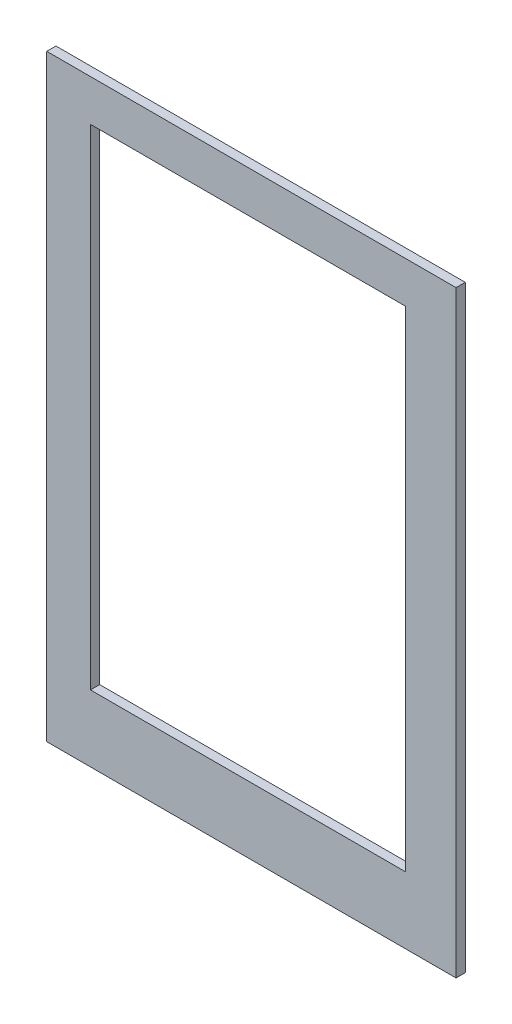
ISO-10303-21;
HEADER;
FILE_DESCRIPTION(('STEP AP214'),'2;1');
FILE_NAME('part.step','',(''),(''),'','','');
FILE_SCHEMA(('AUTOMOTIVE_DESIGN { 1 0 10303 214 1 1 1 1 }'));
ENDSEC;
DATA;
#1=APPLICATION_CONTEXT('core data for automotive mechanical design processes');
#2=APPLICATION_PROTOCOL_DEFINITION('international standard','automotive_design',2000,#1);
#3=PRODUCT_CONTEXT('',#1,'mechanical');
#4=PRODUCT('Part','Part','',(#3));
#5=PRODUCT_RELATED_PRODUCT_CATEGORY('part','',(#4));
#6=PRODUCT_DEFINITION_FORMATION('','',#4);
#7=PRODUCT_DEFINITION_CONTEXT('part definition',#1,'design');
#8=PRODUCT_DEFINITION('design','',#6,#7);
#9=PRODUCT_DEFINITION_SHAPE('','',#8);
#10=(LENGTH_UNIT() NAMED_UNIT(*) SI_UNIT(.MILLI.,.METRE.));
#11=(NAMED_UNIT(*) PLANE_ANGLE_UNIT() SI_UNIT($,.RADIAN.));
#12=(NAMED_UNIT(*) SI_UNIT($,.STERADIAN.) SOLID_ANGLE_UNIT());
#13=UNCERTAINTY_MEASURE_WITH_UNIT(LENGTH_MEASURE(1.E-05),#10,'distance_accuracy_value','');
#14=(GEOMETRIC_REPRESENTATION_CONTEXT(3) GLOBAL_UNCERTAINTY_ASSIGNED_CONTEXT((#13)) GLOBAL_UNIT_ASSIGNED_CONTEXT((#10,
#11,#12)) REPRESENTATION_CONTEXT('',''));
#15=CARTESIAN_POINT('',(0.,0.,0.));
#16=DIRECTION('',(0.,0.,1.));
#17=DIRECTION('',(1.,0.,0.));
#18=AXIS2_PLACEMENT_3D('',#15,#16,#17);
#19=CARTESIAN_POINT('',(0.,0.,-64.6737110149855));
#20=DIRECTION('',(0.,0.,1.));
#21=DIRECTION('',(1.,0.,0.));
#22=AXIS2_PLACEMENT_3D('',#19,#20,#21);
#23=PLANE('',#22);
#24=DIRECTION('',(0.,-1.,0.));
#25=VECTOR('',#24,1.);
#26=CARTESIAN_POINT('',(-153.434862250863,119.124685637272,-64.6737110149855));
#27=LINE('',#26,#25);
#28=CARTESIAN_POINT('',(-153.434862250863,119.124685637272,-64.6737110149855));
#29=VERTEX_POINT('',#28);
#30=CARTESIAN_POINT('',(-153.434862250863,-140.875314362728,-64.6737110149855));
#31=VERTEX_POINT('',#30);
#32=EDGE_CURVE('E140',#29,#31,#27,.T.);
#33=ORIENTED_EDGE('',*,*,#32,.T.);
#34=DIRECTION('',(1.,0.,0.));
#35=VECTOR('',#34,1.);
#36=CARTESIAN_POINT('',(-153.434862250863,-140.875314362728,-64.6737110149855));
#37=LINE('',#36,#35);
#38=CARTESIAN_POINT('',(24.5651377491372,-140.875314362728,-64.6737110149855));
#39=VERTEX_POINT('',#38);
#40=EDGE_CURVE('E143',#31,#39,#37,.T.);
#41=ORIENTED_EDGE('',*,*,#40,.T.);
#42=DIRECTION('',(0.,1.,0.));
#43=VECTOR('',#42,1.);
#44=CARTESIAN_POINT('',(24.5651377491372,119.124685637272,-64.6737110149855));
#45=LINE('',#44,#43);
#46=CARTESIAN_POINT('',(24.5651377491372,119.124685637272,-64.6737110149855));
#47=VERTEX_POINT('',#46);
#48=EDGE_CURVE('E146',#39,#47,#45,.T.);
#49=ORIENTED_EDGE('',*,*,#48,.T.);
#50=DIRECTION('',(-1.,0.,0.));
#51=VECTOR('',#50,1.);
#52=CARTESIAN_POINT('',(-153.434862250863,119.124685637272,-64.6737110149855));
#53=LINE('',#52,#51);
#54=EDGE_CURVE('E148',#47,#29,#53,.T.);
#55=ORIENTED_EDGE('',*,*,#54,.T.);
#56=EDGE_LOOP('',(#33,#41,#49,#55));
#57=FACE_BOUND('',#56,.T.);
#58=DIRECTION('',(1.,0.,0.));
#59=VECTOR('',#58,1.);
#60=CARTESIAN_POINT('',(-134.434862250863,-111.875314362728,-64.6737110149855));
#61=LINE('',#60,#59);
#62=CARTESIAN_POINT('',(-134.434862250863,-111.875314362728,-64.6737110149855));
#63=VERTEX_POINT('',#62);
#64=CARTESIAN_POINT('',(2.56513774913723,-111.875314362728,-64.6737110149855));
#65=VERTEX_POINT('',#64);
#66=EDGE_CURVE('E112',#63,#65,#61,.T.);
#67=ORIENTED_EDGE('',*,*,#66,.F.);
#68=DIRECTION('',(0.,-1.,0.));
#69=VECTOR('',#68,1.);
#70=CARTESIAN_POINT('',(-134.434862250863,101.124685637272,-64.6737110149855));
#71=LINE('',#70,#69);
#72=CARTESIAN_POINT('',(-134.434862250863,101.124685637272,-64.6737110149855));
#73=VERTEX_POINT('',#72);
#74=EDGE_CURVE('E104',#73,#63,#71,.T.);
#75=ORIENTED_EDGE('',*,*,#74,.F.);
#76=DIRECTION('',(-1.,0.,0.));
#77=VECTOR('',#76,1.);
#78=CARTESIAN_POINT('',(-134.434862250863,101.124685637272,-64.6737110149855));
#79=LINE('',#78,#77);
#80=CARTESIAN_POINT('',(2.56513774913719,101.124685637272,-64.6737110149855));
#81=VERTEX_POINT('',#80);
#82=EDGE_CURVE('E126',#81,#73,#79,.T.);
#83=ORIENTED_EDGE('',*,*,#82,.F.);
#84=DIRECTION('',(0.,1.,0.));
#85=VECTOR('',#84,1.);
#86=CARTESIAN_POINT('',(2.56513774913719,101.124685637272,-64.6737110149855));
#87=LINE('',#86,#85);
#88=EDGE_CURVE('E124',#65,#81,#87,.T.);
#89=ORIENTED_EDGE('',*,*,#88,.F.);
#90=EDGE_LOOP('',(#67,#75,#83,#89));
#91=FACE_BOUND('',#90,.T.);
#92=ADVANCED_FACE('F39',(#57,#91),#23,.T.);
#93=CARTESIAN_POINT('',(0.,0.,-68.6737110149856));
#94=DIRECTION('',(0.,0.,1.));
#95=DIRECTION('',(1.,0.,0.));
#96=AXIS2_PLACEMENT_3D('',#93,#94,#95);
#97=PLANE('',#96);
#98=DIRECTION('',(0.,-1.,0.));
#99=VECTOR('',#98,1.);
#100=CARTESIAN_POINT('',(-153.434862250863,119.124685637272,-68.6737110149856));
#101=LINE('',#100,#99);
#102=CARTESIAN_POINT('',(-153.434862250863,119.124685637272,-68.6737110149856));
#103=VERTEX_POINT('',#102);
#104=CARTESIAN_POINT('',(-153.434862250863,-140.875314362728,-68.6737110149856));
#105=VERTEX_POINT('',#104);
#106=EDGE_CURVE('E120',#103,#105,#101,.T.);
#107=ORIENTED_EDGE('',*,*,#106,.F.);
#108=DIRECTION('',(-1.,0.,0.));
#109=VECTOR('',#108,1.);
#110=CARTESIAN_POINT('',(-153.434862250863,119.124685637272,-68.6737110149856));
#111=LINE('',#110,#109);
#112=CARTESIAN_POINT('',(24.5651377491372,119.124685637272,-68.6737110149856));
#113=VERTEX_POINT('',#112);
#114=EDGE_CURVE('E144',#113,#103,#111,.T.);
#115=ORIENTED_EDGE('',*,*,#114,.F.);
#116=DIRECTION('',(0.,1.,0.));
#117=VECTOR('',#116,1.);
#118=CARTESIAN_POINT('',(24.5651377491372,119.124685637272,-68.6737110149856));
#119=LINE('',#118,#117);
#120=CARTESIAN_POINT('',(24.5651377491372,-140.875314362728,-68.6737110149856));
#121=VERTEX_POINT('',#120);
#122=EDGE_CURVE('E155',#121,#113,#119,.T.);
#123=ORIENTED_EDGE('',*,*,#122,.F.);
#124=DIRECTION('',(1.,0.,0.));
#125=VECTOR('',#124,1.);
#126=CARTESIAN_POINT('',(-153.434862250863,-140.875314362728,-68.6737110149856));
#127=LINE('',#126,#125);
#128=EDGE_CURVE('E153',#105,#121,#127,.T.);
#129=ORIENTED_EDGE('',*,*,#128,.F.);
#130=EDGE_LOOP('',(#107,#115,#123,#129));
#131=FACE_BOUND('',#130,.T.);
#132=DIRECTION('',(0.,-1.,0.));
#133=VECTOR('',#132,1.);
#134=CARTESIAN_POINT('',(-134.434862250863,101.124685637272,-68.6737110149856));
#135=LINE('',#134,#133);
#136=CARTESIAN_POINT('',(-134.434862250863,101.124685637272,-68.6737110149856));
#137=VERTEX_POINT('',#136);
#138=CARTESIAN_POINT('',(-134.434862250863,-111.875314362728,-68.6737110149856));
#139=VERTEX_POINT('',#138);
#140=EDGE_CURVE('E62',#137,#139,#135,.T.);
#141=ORIENTED_EDGE('',*,*,#140,.T.);
#142=DIRECTION('',(1.,0.,0.));
#143=VECTOR('',#142,1.);
#144=CARTESIAN_POINT('',(-134.434862250863,-111.875314362728,-68.6737110149856));
#145=LINE('',#144,#143);
#146=CARTESIAN_POINT('',(2.56513774913723,-111.875314362728,-68.6737110149856));
#147=VERTEX_POINT('',#146);
#148=EDGE_CURVE('E119',#139,#147,#145,.T.);
#149=ORIENTED_EDGE('',*,*,#148,.T.);
#150=DIRECTION('',(0.,1.,0.));
#151=VECTOR('',#150,1.);
#152=CARTESIAN_POINT('',(2.56513774913719,101.124685637272,-68.6737110149856));
#153=LINE('',#152,#151);
#154=CARTESIAN_POINT('',(2.56513774913719,101.124685637272,-68.6737110149856));
#155=VERTEX_POINT('',#154);
#156=EDGE_CURVE('E132',#147,#155,#153,.T.);
#157=ORIENTED_EDGE('',*,*,#156,.T.);
#158=DIRECTION('',(-1.,0.,0.));
#159=VECTOR('',#158,1.);
#160=CARTESIAN_POINT('',(-134.434862250863,101.124685637272,-68.6737110149856));
#161=LINE('',#160,#159);
#162=EDGE_CURVE('E113',#155,#137,#161,.T.);
#163=ORIENTED_EDGE('',*,*,#162,.T.);
#164=EDGE_LOOP('',(#141,#149,#157,#163));
#165=FACE_BOUND('',#164,.T.);
#166=ADVANCED_FACE('F173',(#131,#165),#97,.F.);
#167=CARTESIAN_POINT('',(-153.434862250863,119.124685637272,-64.6737110149855));
#168=DIRECTION('',(1.,0.,0.));
#169=DIRECTION('',(0.,1.,0.));
#170=AXIS2_PLACEMENT_3D('',#167,#168,#169);
#171=PLANE('',#170);
#172=ORIENTED_EDGE('',*,*,#106,.T.);
#173=DIRECTION('',(0.,0.,-1.));
#174=VECTOR('',#173,1.);
#175=CARTESIAN_POINT('',(-153.434862250863,-140.875314362728,-64.6737110149855));
#176=LINE('',#175,#174);
#177=EDGE_CURVE('E11',#31,#105,#176,.T.);
#178=ORIENTED_EDGE('',*,*,#177,.F.);
#179=ORIENTED_EDGE('',*,*,#32,.F.);
#180=DIRECTION('',(0.,0.,-1.));
#181=VECTOR('',#180,1.);
#182=CARTESIAN_POINT('',(-153.434862250863,119.124685637272,-64.6737110149855));
#183=LINE('',#182,#181);
#184=EDGE_CURVE('E150',#29,#103,#183,.T.);
#185=ORIENTED_EDGE('',*,*,#184,.T.);
#186=EDGE_LOOP('',(#172,#178,#179,#185));
#187=FACE_BOUND('',#186,.T.);
#188=ADVANCED_FACE('F41',(#187),#171,.F.);
#189=CARTESIAN_POINT('',(-153.434862250863,-140.875314362728,-64.6737110149855));
#190=DIRECTION('',(0.,1.,0.));
#191=DIRECTION('',(0.,0.,1.));
#192=AXIS2_PLACEMENT_3D('',#189,#190,#191);
#193=PLANE('',#192);
#194=ORIENTED_EDGE('',*,*,#128,.T.);
#195=DIRECTION('',(0.,0.,-1.));
#196=VECTOR('',#195,1.);
#197=CARTESIAN_POINT('',(24.5651377491372,-140.875314362728,-64.6737110149855));
#198=LINE('',#197,#196);
#199=EDGE_CURVE('E47',#39,#121,#198,.T.);
#200=ORIENTED_EDGE('',*,*,#199,.F.);
#201=ORIENTED_EDGE('',*,*,#40,.F.);
#202=ORIENTED_EDGE('',*,*,#177,.T.);
#203=EDGE_LOOP('',(#194,#200,#201,#202));
#204=FACE_BOUND('',#203,.T.);
#205=ADVANCED_FACE('F183',(#204),#193,.F.);
#206=CARTESIAN_POINT('',(24.5651377491372,119.124685637272,-64.6737110149855));
#207=DIRECTION('',(-1.,0.,0.));
#208=DIRECTION('',(0.,-1.,0.));
#209=AXIS2_PLACEMENT_3D('',#206,#207,#208);
#210=PLANE('',#209);
#211=ORIENTED_EDGE('',*,*,#122,.T.);
#212=DIRECTION('',(0.,0.,-1.));
#213=VECTOR('',#212,1.);
#214=CARTESIAN_POINT('',(24.5651377491372,119.124685637272,-64.6737110149855));
#215=LINE('',#214,#213);
#216=EDGE_CURVE('E160',#47,#113,#215,.T.);
#217=ORIENTED_EDGE('',*,*,#216,.F.);
#218=ORIENTED_EDGE('',*,*,#48,.F.);
#219=ORIENTED_EDGE('',*,*,#199,.T.);
#220=EDGE_LOOP('',(#211,#217,#218,#219));
#221=FACE_BOUND('',#220,.T.);
#222=ADVANCED_FACE('F167',(#221),#210,.F.);
#223=CARTESIAN_POINT('',(-153.434862250863,119.124685637272,-64.6737110149855));
#224=DIRECTION('',(0.,-1.,0.));
#225=DIRECTION('',(0.,0.,-1.));
#226=AXIS2_PLACEMENT_3D('',#223,#224,#225);
#227=PLANE('',#226);
#228=ORIENTED_EDGE('',*,*,#114,.T.);
#229=ORIENTED_EDGE('',*,*,#184,.F.);
#230=ORIENTED_EDGE('',*,*,#54,.F.);
#231=ORIENTED_EDGE('',*,*,#216,.T.);
#232=EDGE_LOOP('',(#228,#229,#230,#231));
#233=FACE_BOUND('',#232,.T.);
#234=ADVANCED_FACE('F177',(#233),#227,.F.);
#235=CARTESIAN_POINT('',(-134.434862250863,101.124685637272,-64.6737110149855));
#236=DIRECTION('',(1.,0.,0.));
#237=DIRECTION('',(0.,1.,0.));
#238=AXIS2_PLACEMENT_3D('',#235,#236,#237);
#239=PLANE('',#238);
#240=ORIENTED_EDGE('',*,*,#140,.F.);
#241=DIRECTION('',(0.,0.,-1.));
#242=VECTOR('',#241,1.);
#243=CARTESIAN_POINT('',(-134.434862250863,101.124685637272,-64.6737110149855));
#244=LINE('',#243,#242);
#245=EDGE_CURVE('E108',#73,#137,#244,.T.);
#246=ORIENTED_EDGE('',*,*,#245,.F.);
#247=ORIENTED_EDGE('',*,*,#74,.T.);
#248=DIRECTION('',(0.,0.,-1.));
#249=VECTOR('',#248,1.);
#250=CARTESIAN_POINT('',(-134.434862250863,-111.875314362728,-64.6737110149855));
#251=LINE('',#250,#249);
#252=EDGE_CURVE('E107',#63,#139,#251,.T.);
#253=ORIENTED_EDGE('',*,*,#252,.T.);
#254=EDGE_LOOP('',(#240,#246,#247,#253));
#255=FACE_BOUND('',#254,.T.);
#256=ADVANCED_FACE('F106',(#255),#239,.T.);
#257=CARTESIAN_POINT('',(-134.434862250863,-111.875314362728,-64.6737110149855));
#258=DIRECTION('',(0.,1.,0.));
#259=DIRECTION('',(0.,0.,1.));
#260=AXIS2_PLACEMENT_3D('',#257,#258,#259);
#261=PLANE('',#260);
#262=ORIENTED_EDGE('',*,*,#148,.F.);
#263=ORIENTED_EDGE('',*,*,#252,.F.);
#264=ORIENTED_EDGE('',*,*,#66,.T.);
#265=DIRECTION('',(0.,0.,-1.));
#266=VECTOR('',#265,1.);
#267=CARTESIAN_POINT('',(2.56513774913723,-111.875314362728,-64.6737110149855));
#268=LINE('',#267,#266);
#269=EDGE_CURVE('E121',#65,#147,#268,.T.);
#270=ORIENTED_EDGE('',*,*,#269,.T.);
#271=EDGE_LOOP('',(#262,#263,#264,#270));
#272=FACE_BOUND('',#271,.T.);
#273=ADVANCED_FACE('F116',(#272),#261,.T.);
#274=CARTESIAN_POINT('',(2.56513774913719,101.124685637272,-64.6737110149855));
#275=DIRECTION('',(-1.,0.,0.));
#276=DIRECTION('',(0.,-1.,0.));
#277=AXIS2_PLACEMENT_3D('',#274,#275,#276);
#278=PLANE('',#277);
#279=ORIENTED_EDGE('',*,*,#156,.F.);
#280=ORIENTED_EDGE('',*,*,#269,.F.);
#281=ORIENTED_EDGE('',*,*,#88,.T.);
#282=DIRECTION('',(0.,0.,-1.));
#283=VECTOR('',#282,1.);
#284=CARTESIAN_POINT('',(2.56513774913719,101.124685637272,-64.6737110149855));
#285=LINE('',#284,#283);
#286=EDGE_CURVE('E54',#81,#155,#285,.T.);
#287=ORIENTED_EDGE('',*,*,#286,.T.);
#288=EDGE_LOOP('',(#279,#280,#281,#287));
#289=FACE_BOUND('',#288,.T.);
#290=ADVANCED_FACE('F206',(#289),#278,.T.);
#291=CARTESIAN_POINT('',(-134.434862250863,101.124685637272,-64.6737110149855));
#292=DIRECTION('',(0.,-1.,0.));
#293=DIRECTION('',(0.,0.,-1.));
#294=AXIS2_PLACEMENT_3D('',#291,#292,#293);
#295=PLANE('',#294);
#296=ORIENTED_EDGE('',*,*,#162,.F.);
#297=ORIENTED_EDGE('',*,*,#286,.F.);
#298=ORIENTED_EDGE('',*,*,#82,.T.);
#299=ORIENTED_EDGE('',*,*,#245,.T.);
#300=EDGE_LOOP('',(#296,#297,#298,#299));
#301=FACE_BOUND('',#300,.T.);
#302=ADVANCED_FACE('F210',(#301),#295,.T.);
#303=CLOSED_SHELL('',(#92,#166,#188,#205,#222,#234,#256,#273,#290,#302));
#304=MANIFOLD_SOLID_BREP('B2',#303);
#305=ADVANCED_BREP_SHAPE_REPRESENTATION('',(#18,#304),#14);
#306=SHAPE_DEFINITION_REPRESENTATION(#9,#305);
ENDSEC;
END-ISO-10303-21;
